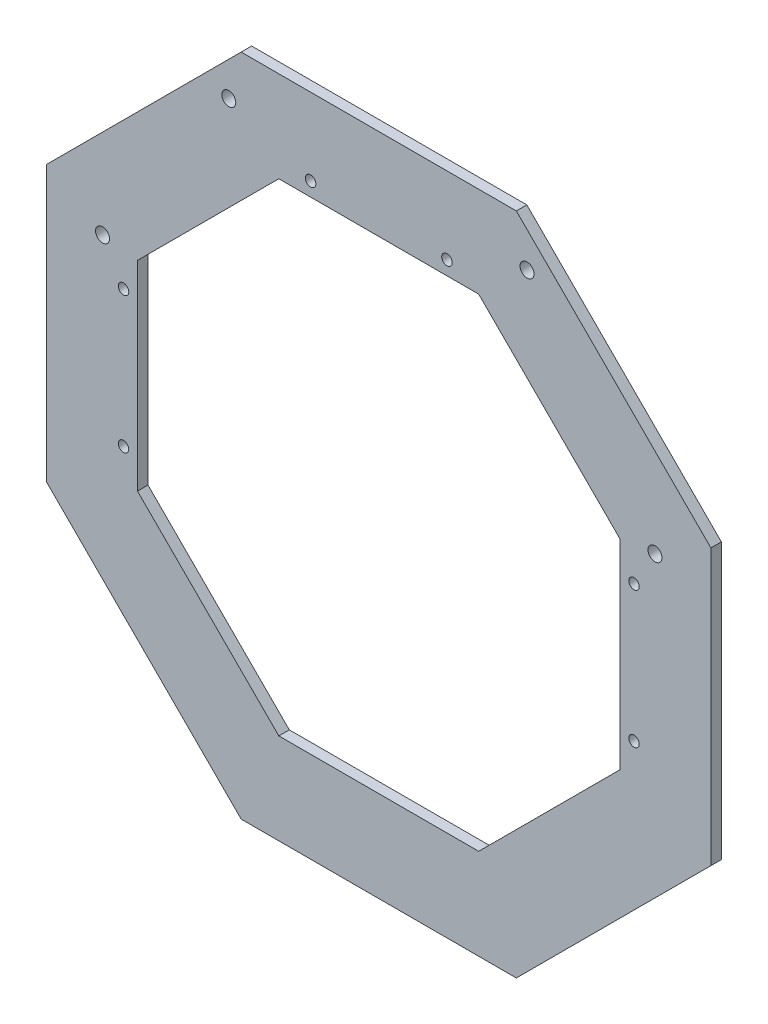
ISO-10303-21;
HEADER;
FILE_DESCRIPTION(('STEP AP214'),'2;1');
FILE_NAME('part.step','',(''),(''),'','','');
FILE_SCHEMA(('AUTOMOTIVE_DESIGN { 1 0 10303 214 1 1 1 1 }'));
ENDSEC;
DATA;
#1=APPLICATION_CONTEXT('core data for automotive mechanical design processes');
#2=APPLICATION_PROTOCOL_DEFINITION('international standard','automotive_design',2000,#1);
#3=PRODUCT_CONTEXT('',#1,'mechanical');
#4=PRODUCT('Part','Part','',(#3));
#5=PRODUCT_RELATED_PRODUCT_CATEGORY('part','',(#4));
#6=PRODUCT_DEFINITION_FORMATION('','',#4);
#7=PRODUCT_DEFINITION_CONTEXT('part definition',#1,'design');
#8=PRODUCT_DEFINITION('design','',#6,#7);
#9=PRODUCT_DEFINITION_SHAPE('','',#8);
#10=(LENGTH_UNIT() NAMED_UNIT(*) SI_UNIT(.MILLI.,.METRE.));
#11=(NAMED_UNIT(*) PLANE_ANGLE_UNIT() SI_UNIT($,.RADIAN.));
#12=(NAMED_UNIT(*) SI_UNIT($,.STERADIAN.) SOLID_ANGLE_UNIT());
#13=UNCERTAINTY_MEASURE_WITH_UNIT(LENGTH_MEASURE(1.E-05),#10,'distance_accuracy_value','');
#14=(GEOMETRIC_REPRESENTATION_CONTEXT(3) GLOBAL_UNCERTAINTY_ASSIGNED_CONTEXT((#13)) GLOBAL_UNIT_ASSIGNED_CONTEXT((#10,
#11,#12)) REPRESENTATION_CONTEXT('',''));
#15=CARTESIAN_POINT('',(0.,0.,0.));
#16=DIRECTION('',(0.,0.,1.));
#17=DIRECTION('',(1.,0.,0.));
#18=AXIS2_PLACEMENT_3D('',#15,#16,#17);
#19=CARTESIAN_POINT('',(39.350288425444,94.9999999999999,3.));
#20=DIRECTION('',(0.,-1.,0.));
#21=DIRECTION('',(1.,0.,0.));
#22=AXIS2_PLACEMENT_3D('',#19,#20,#21);
#23=PLANE('',#22);
#24=DIRECTION('',(-1.,0.,0.));
#25=VECTOR('',#24,1.);
#26=CARTESIAN_POINT('',(39.350288425444,94.9999999999999,0.));
#27=LINE('',#26,#25);
#28=CARTESIAN_POINT('',(39.350288425444,94.9999999999999,0.));
#29=VERTEX_POINT('',#28);
#30=CARTESIAN_POINT('',(-39.3502884254442,94.9999999999997,0.));
#31=VERTEX_POINT('',#30);
#32=EDGE_CURVE('E205',#29,#31,#27,.T.);
#33=ORIENTED_EDGE('',*,*,#32,.T.);
#34=DIRECTION('',(0.,0.,-1.));
#35=VECTOR('',#34,1.);
#36=CARTESIAN_POINT('',(-39.3502884254442,94.9999999999997,3.));
#37=LINE('',#36,#35);
#38=CARTESIAN_POINT('',(-39.3502884254442,94.9999999999997,3.));
#39=VERTEX_POINT('',#38);
#40=EDGE_CURVE('E11',#39,#31,#37,.T.);
#41=ORIENTED_EDGE('',*,*,#40,.F.);
#42=DIRECTION('',(-1.,0.,0.));
#43=VECTOR('',#42,1.);
#44=CARTESIAN_POINT('',(39.350288425444,94.9999999999999,3.));
#45=LINE('',#44,#43);
#46=CARTESIAN_POINT('',(39.350288425444,94.9999999999999,3.));
#47=VERTEX_POINT('',#46);
#48=EDGE_CURVE('E217',#47,#39,#45,.T.);
#49=ORIENTED_EDGE('',*,*,#48,.F.);
#50=DIRECTION('',(0.,0.,-1.));
#51=VECTOR('',#50,1.);
#52=CARTESIAN_POINT('',(39.350288425444,94.9999999999999,3.));
#53=LINE('',#52,#51);
#54=EDGE_CURVE('E235',#47,#29,#53,.T.);
#55=ORIENTED_EDGE('',*,*,#54,.T.);
#56=EDGE_LOOP('',(#33,#41,#49,#55));
#57=FACE_BOUND('',#56,.T.);
#58=ADVANCED_FACE('F32',(#57),#23,.F.);
#59=CARTESIAN_POINT('',(-39.3502884254442,94.9999999999997,3.));
#60=DIRECTION('',(0.707106781186547,-0.707106781186548,0.));
#61=DIRECTION('',(0.707106781186548,0.707106781186547,0.));
#62=AXIS2_PLACEMENT_3D('',#59,#60,#61);
#63=PLANE('',#62);
#64=DIRECTION('',(-0.707106781186548,-0.707106781186547,0.));
#65=VECTOR('',#64,1.);
#66=CARTESIAN_POINT('',(-39.3502884254442,94.9999999999997,0.));
#67=LINE('',#66,#65);
#68=CARTESIAN_POINT('',(-95.0000000000001,39.3502884254438,0.));
#69=VERTEX_POINT('',#68);
#70=EDGE_CURVE('E238',#31,#69,#67,.T.);
#71=ORIENTED_EDGE('',*,*,#70,.T.);
#72=DIRECTION('',(0.,0.,-1.));
#73=VECTOR('',#72,1.);
#74=CARTESIAN_POINT('',(-95.0000000000001,39.3502884254438,3.));
#75=LINE('',#74,#73);
#76=CARTESIAN_POINT('',(-95.0000000000001,39.3502884254438,3.));
#77=VERTEX_POINT('',#76);
#78=EDGE_CURVE('E39',#77,#69,#75,.T.);
#79=ORIENTED_EDGE('',*,*,#78,.F.);
#80=DIRECTION('',(-0.707106781186548,-0.707106781186547,0.));
#81=VECTOR('',#80,1.);
#82=CARTESIAN_POINT('',(-39.3502884254442,94.9999999999997,3.));
#83=LINE('',#82,#81);
#84=EDGE_CURVE('E220',#39,#77,#83,.T.);
#85=ORIENTED_EDGE('',*,*,#84,.F.);
#86=ORIENTED_EDGE('',*,*,#40,.T.);
#87=EDGE_LOOP('',(#71,#79,#85,#86));
#88=FACE_BOUND('',#87,.T.);
#89=ADVANCED_FACE('F293',(#88),#63,.F.);
#90=CARTESIAN_POINT('',(-95.0000000000001,39.3502884254438,3.));
#91=DIRECTION('',(1.,0.,0.));
#92=DIRECTION('',(0.,1.,0.));
#93=AXIS2_PLACEMENT_3D('',#90,#91,#92);
#94=PLANE('',#93);
#95=DIRECTION('',(0.,-1.,0.));
#96=VECTOR('',#95,1.);
#97=CARTESIAN_POINT('',(-95.0000000000001,39.3502884254438,0.));
#98=LINE('',#97,#96);
#99=CARTESIAN_POINT('',(-94.9999999999999,-39.3502884254442,0.));
#100=VERTEX_POINT('',#99);
#101=EDGE_CURVE('E240',#69,#100,#98,.T.);
#102=ORIENTED_EDGE('',*,*,#101,.T.);
#103=DIRECTION('',(0.,0.,-1.));
#104=VECTOR('',#103,1.);
#105=CARTESIAN_POINT('',(-94.9999999999999,-39.3502884254442,3.));
#106=LINE('',#105,#104);
#107=CARTESIAN_POINT('',(-94.9999999999999,-39.3502884254442,3.));
#108=VERTEX_POINT('',#107);
#109=EDGE_CURVE('E265',#108,#100,#106,.T.);
#110=ORIENTED_EDGE('',*,*,#109,.F.);
#111=DIRECTION('',(0.,-1.,0.));
#112=VECTOR('',#111,1.);
#113=CARTESIAN_POINT('',(-95.0000000000001,39.3502884254438,3.));
#114=LINE('',#113,#112);
#115=EDGE_CURVE('E223',#77,#108,#114,.T.);
#116=ORIENTED_EDGE('',*,*,#115,.F.);
#117=ORIENTED_EDGE('',*,*,#78,.T.);
#118=EDGE_LOOP('',(#102,#110,#116,#117));
#119=FACE_BOUND('',#118,.T.);
#120=ADVANCED_FACE('F272',(#119),#94,.F.);
#121=CARTESIAN_POINT('',(-94.9999999999999,-39.3502884254442,3.));
#122=DIRECTION('',(0.707106781186546,0.707106781186549,0.));
#123=DIRECTION('',(-0.707106781186549,0.707106781186546,0.));
#124=AXIS2_PLACEMENT_3D('',#121,#122,#123);
#125=PLANE('',#124);
#126=DIRECTION('',(0.707106781186549,-0.707106781186546,0.));
#127=VECTOR('',#126,1.);
#128=CARTESIAN_POINT('',(-94.9999999999999,-39.3502884254442,0.));
#129=LINE('',#128,#127);
#130=CARTESIAN_POINT('',(-39.3502884254438,-95.0000000000001,0.));
#131=VERTEX_POINT('',#130);
#132=EDGE_CURVE('E242',#100,#131,#129,.T.);
#133=ORIENTED_EDGE('',*,*,#132,.T.);
#134=DIRECTION('',(0.,0.,-1.));
#135=VECTOR('',#134,1.);
#136=CARTESIAN_POINT('',(-39.3502884254438,-95.0000000000001,3.));
#137=LINE('',#136,#135);
#138=CARTESIAN_POINT('',(-39.3502884254438,-95.0000000000001,3.));
#139=VERTEX_POINT('',#138);
#140=EDGE_CURVE('E262',#139,#131,#137,.T.);
#141=ORIENTED_EDGE('',*,*,#140,.F.);
#142=DIRECTION('',(0.707106781186549,-0.707106781186546,0.));
#143=VECTOR('',#142,1.);
#144=CARTESIAN_POINT('',(-94.9999999999999,-39.3502884254442,3.));
#145=LINE('',#144,#143);
#146=EDGE_CURVE('E225',#108,#139,#145,.T.);
#147=ORIENTED_EDGE('',*,*,#146,.F.);
#148=ORIENTED_EDGE('',*,*,#109,.T.);
#149=EDGE_LOOP('',(#133,#141,#147,#148));
#150=FACE_BOUND('',#149,.T.);
#151=ADVANCED_FACE('F283',(#150),#125,.F.);
#152=CARTESIAN_POINT('',(-39.3502884254438,-95.0000000000001,3.));
#153=DIRECTION('',(0.,1.,0.));
#154=DIRECTION('',(-1.,0.,0.));
#155=AXIS2_PLACEMENT_3D('',#152,#153,#154);
#156=PLANE('',#155);
#157=DIRECTION('',(1.,0.,0.));
#158=VECTOR('',#157,1.);
#159=CARTESIAN_POINT('',(-39.3502884254438,-95.0000000000001,0.));
#160=LINE('',#159,#158);
#161=CARTESIAN_POINT('',(39.3502884254442,-94.9999999999999,0.));
#162=VERTEX_POINT('',#161);
#163=EDGE_CURVE('E244',#131,#162,#160,.T.);
#164=ORIENTED_EDGE('',*,*,#163,.T.);
#165=DIRECTION('',(0.,0.,-1.));
#166=VECTOR('',#165,1.);
#167=CARTESIAN_POINT('',(39.3502884254442,-94.9999999999999,3.));
#168=LINE('',#167,#166);
#169=CARTESIAN_POINT('',(39.3502884254442,-94.9999999999999,3.));
#170=VERTEX_POINT('',#169);
#171=EDGE_CURVE('E259',#170,#162,#168,.T.);
#172=ORIENTED_EDGE('',*,*,#171,.F.);
#173=DIRECTION('',(1.,0.,0.));
#174=VECTOR('',#173,1.);
#175=CARTESIAN_POINT('',(-39.3502884254438,-95.0000000000001,3.));
#176=LINE('',#175,#174);
#177=EDGE_CURVE('E227',#139,#170,#176,.T.);
#178=ORIENTED_EDGE('',*,*,#177,.F.);
#179=ORIENTED_EDGE('',*,*,#140,.T.);
#180=EDGE_LOOP('',(#164,#172,#178,#179));
#181=FACE_BOUND('',#180,.T.);
#182=ADVANCED_FACE('F287',(#181),#156,.F.);
#183=CARTESIAN_POINT('',(39.3502884254442,-94.9999999999999,3.));
#184=DIRECTION('',(-0.707106781186547,0.707106781186548,0.));
#185=DIRECTION('',(-0.707106781186548,-0.707106781186547,0.));
#186=AXIS2_PLACEMENT_3D('',#183,#184,#185);
#187=PLANE('',#186);
#188=DIRECTION('',(0.707106781186548,0.707106781186547,0.));
#189=VECTOR('',#188,1.);
#190=CARTESIAN_POINT('',(39.3502884254442,-94.9999999999999,0.));
#191=LINE('',#190,#189);
#192=CARTESIAN_POINT('',(95.0000000000002,-39.350288425444,0.));
#193=VERTEX_POINT('',#192);
#194=EDGE_CURVE('E246',#162,#193,#191,.T.);
#195=ORIENTED_EDGE('',*,*,#194,.T.);
#196=DIRECTION('',(0.,0.,-1.));
#197=VECTOR('',#196,1.);
#198=CARTESIAN_POINT('',(95.0000000000002,-39.350288425444,3.));
#199=LINE('',#198,#197);
#200=CARTESIAN_POINT('',(95.0000000000002,-39.350288425444,3.));
#201=VERTEX_POINT('',#200);
#202=EDGE_CURVE('E256',#201,#193,#199,.T.);
#203=ORIENTED_EDGE('',*,*,#202,.F.);
#204=DIRECTION('',(0.707106781186548,0.707106781186547,0.));
#205=VECTOR('',#204,1.);
#206=CARTESIAN_POINT('',(39.3502884254442,-94.9999999999999,3.));
#207=LINE('',#206,#205);
#208=EDGE_CURVE('E229',#170,#201,#207,.T.);
#209=ORIENTED_EDGE('',*,*,#208,.F.);
#210=ORIENTED_EDGE('',*,*,#171,.T.);
#211=EDGE_LOOP('',(#195,#203,#209,#210));
#212=FACE_BOUND('',#211,.T.);
#213=ADVANCED_FACE('F306',(#212),#187,.F.);
#214=CARTESIAN_POINT('',(95.0000000000002,-39.350288425444,3.));
#215=DIRECTION('',(-1.,0.,0.));
#216=DIRECTION('',(0.,-1.,0.));
#217=AXIS2_PLACEMENT_3D('',#214,#215,#216);
#218=PLANE('',#217);
#219=DIRECTION('',(0.,1.,0.));
#220=VECTOR('',#219,1.);
#221=CARTESIAN_POINT('',(95.0000000000002,-39.350288425444,0.));
#222=LINE('',#221,#220);
#223=CARTESIAN_POINT('',(95.,39.3502884254441,0.));
#224=VERTEX_POINT('',#223);
#225=EDGE_CURVE('E248',#193,#224,#222,.T.);
#226=ORIENTED_EDGE('',*,*,#225,.T.);
#227=DIRECTION('',(0.,0.,-1.));
#228=VECTOR('',#227,1.);
#229=CARTESIAN_POINT('',(95.,39.3502884254441,3.));
#230=LINE('',#229,#228);
#231=CARTESIAN_POINT('',(95.,39.3502884254441,3.));
#232=VERTEX_POINT('',#231);
#233=EDGE_CURVE('E253',#232,#224,#230,.T.);
#234=ORIENTED_EDGE('',*,*,#233,.F.);
#235=DIRECTION('',(0.,1.,0.));
#236=VECTOR('',#235,1.);
#237=CARTESIAN_POINT('',(95.0000000000002,-39.350288425444,3.));
#238=LINE('',#237,#236);
#239=EDGE_CURVE('E231',#201,#232,#238,.T.);
#240=ORIENTED_EDGE('',*,*,#239,.F.);
#241=ORIENTED_EDGE('',*,*,#202,.T.);
#242=EDGE_LOOP('',(#226,#234,#240,#241));
#243=FACE_BOUND('',#242,.T.);
#244=ADVANCED_FACE('F304',(#243),#218,.F.);
#245=CARTESIAN_POINT('',(95.,39.3502884254441,3.));
#246=DIRECTION('',(-0.707106781186546,-0.707106781186549,0.));
#247=DIRECTION('',(0.707106781186549,-0.707106781186546,0.));
#248=AXIS2_PLACEMENT_3D('',#245,#246,#247);
#249=PLANE('',#248);
#250=DIRECTION('',(-0.707106781186549,0.707106781186546,0.));
#251=VECTOR('',#250,1.);
#252=CARTESIAN_POINT('',(95.,39.3502884254441,0.));
#253=LINE('',#252,#251);
#254=EDGE_CURVE('E221',#224,#29,#253,.T.);
#255=ORIENTED_EDGE('',*,*,#254,.T.);
#256=ORIENTED_EDGE('',*,*,#54,.F.);
#257=DIRECTION('',(-0.707106781186549,0.707106781186546,0.));
#258=VECTOR('',#257,1.);
#259=CARTESIAN_POINT('',(95.,39.3502884254441,3.));
#260=LINE('',#259,#258);
#261=EDGE_CURVE('E233',#232,#47,#260,.T.);
#262=ORIENTED_EDGE('',*,*,#261,.F.);
#263=ORIENTED_EDGE('',*,*,#233,.T.);
#264=EDGE_LOOP('',(#255,#256,#262,#263));
#265=FACE_BOUND('',#264,.T.);
#266=ADVANCED_FACE('F299',(#265),#249,.F.);
#267=CARTESIAN_POINT('',(0.,0.,3.));
#268=DIRECTION('',(0.,0.,1.));
#269=DIRECTION('',(1.,0.,0.));
#270=AXIS2_PLACEMENT_3D('',#267,#268,#269);
#271=PLANE('',#270);
#272=CARTESIAN_POINT('',(-79.0000000000001,29.8944443027285,3.));
#273=DIRECTION('',(0.,0.,1.));
#274=DIRECTION('',(1.,0.,0.));
#275=AXIS2_PLACEMENT_3D('',#272,#273,#274);
#276=CIRCLE('',#275,2.);
#277=CARTESIAN_POINT('',(-77.0000000000001,29.8944443027285,3.));
#278=VERTEX_POINT('',#277);
#279=EDGE_CURVE('E550',#278,#278,#276,.T.);
#280=ORIENTED_EDGE('',*,*,#279,.F.);
#281=EDGE_LOOP('',(#280));
#282=FACE_BOUND('',#281,.T.);
#283=CARTESIAN_POINT('',(79.,29.8944443027287,3.));
#284=DIRECTION('',(0.,0.,1.));
#285=DIRECTION('',(-1.,0.,0.));
#286=AXIS2_PLACEMENT_3D('',#283,#284,#285);
#287=CIRCLE('',#286,2.);
#288=CARTESIAN_POINT('',(77.,29.8944443027287,3.));
#289=VERTEX_POINT('',#288);
#290=EDGE_CURVE('E552',#289,#289,#287,.T.);
#291=ORIENTED_EDGE('',*,*,#290,.F.);
#292=EDGE_LOOP('',(#291));
#293=FACE_BOUND('',#292,.T.);
#294=CARTESIAN_POINT('',(42.4093721325955,81.8999999999999,3.));
#295=DIRECTION('',(0.,0.,1.));
#296=DIRECTION('',(1.,0.,0.));
#297=AXIS2_PLACEMENT_3D('',#294,#295,#296);
#298=CIRCLE('',#297,2.);
#299=CARTESIAN_POINT('',(44.4093721325955,81.8999999999999,3.));
#300=VERTEX_POINT('',#299);
#301=EDGE_CURVE('E638',#300,#300,#298,.T.);
#302=ORIENTED_EDGE('',*,*,#301,.F.);
#303=EDGE_LOOP('',(#302));
#304=FACE_BOUND('',#303,.T.);
#305=CARTESIAN_POINT('',(-42.8922148450701,81.6999999999999,3.));
#306=DIRECTION('',(0.,0.,1.));
#307=DIRECTION('',(1.,0.,0.));
#308=AXIS2_PLACEMENT_3D('',#305,#306,#307);
#309=CIRCLE('',#308,2.);
#310=CARTESIAN_POINT('',(-40.8922148450701,81.6999999999999,3.));
#311=VERTEX_POINT('',#310);
#312=EDGE_CURVE('E560',#311,#311,#309,.T.);
#313=ORIENTED_EDGE('',*,*,#312,.F.);
#314=EDGE_LOOP('',(#313));
#315=FACE_BOUND('',#314,.T.);
#316=CARTESIAN_POINT('',(-73.0000000000002,19.4999999999998,3.));
#317=DIRECTION('',(0.,0.,-1.));
#318=DIRECTION('',(1.,0.,0.));
#319=AXIS2_PLACEMENT_3D('',#316,#317,#318);
#320=CIRCLE('',#319,1.5);
#321=CARTESIAN_POINT('',(-71.5000000000002,19.4999999999998,3.));
#322=VERTEX_POINT('',#321);
#323=EDGE_CURVE('E577',#322,#322,#320,.T.);
#324=ORIENTED_EDGE('',*,*,#323,.T.);
#325=EDGE_LOOP('',(#324));
#326=FACE_BOUND('',#325,.T.);
#327=CARTESIAN_POINT('',(73.0000000000002,-19.5,3.));
#328=DIRECTION('',(0.,0.,-1.));
#329=DIRECTION('',(-1.,0.,0.));
#330=AXIS2_PLACEMENT_3D('',#327,#328,#329);
#331=CIRCLE('',#330,1.5);
#332=CARTESIAN_POINT('',(71.5000000000002,-19.5,3.));
#333=VERTEX_POINT('',#332);
#334=EDGE_CURVE('E570',#333,#333,#331,.T.);
#335=ORIENTED_EDGE('',*,*,#334,.T.);
#336=EDGE_LOOP('',(#335));
#337=FACE_BOUND('',#336,.T.);
#338=CARTESIAN_POINT('',(73.0000000000002,19.5,3.));
#339=DIRECTION('',(0.,0.,-1.));
#340=DIRECTION('',(-1.,0.,0.));
#341=AXIS2_PLACEMENT_3D('',#338,#339,#340);
#342=CIRCLE('',#341,1.5);
#343=CARTESIAN_POINT('',(71.5000000000002,19.5,3.));
#344=VERTEX_POINT('',#343);
#345=EDGE_CURVE('E588',#344,#344,#342,.T.);
#346=ORIENTED_EDGE('',*,*,#345,.T.);
#347=EDGE_LOOP('',(#346));
#348=FACE_BOUND('',#347,.T.);
#349=CARTESIAN_POINT('',(-19.5,73.0000000000007,3.));
#350=DIRECTION('',(0.,0.,-1.));
#351=DIRECTION('',(-1.,0.,0.));
#352=AXIS2_PLACEMENT_3D('',#349,#350,#351);
#353=CIRCLE('',#352,1.5);
#354=CARTESIAN_POINT('',(-21.,73.0000000000007,3.));
#355=VERTEX_POINT('',#354);
#356=EDGE_CURVE('E582',#355,#355,#353,.T.);
#357=ORIENTED_EDGE('',*,*,#356,.T.);
#358=EDGE_LOOP('',(#357));
#359=FACE_BOUND('',#358,.T.);
#360=CARTESIAN_POINT('',(-73.0000000000002,-19.5000000000001,3.));
#361=DIRECTION('',(0.,0.,-1.));
#362=DIRECTION('',(1.,0.,0.));
#363=AXIS2_PLACEMENT_3D('',#360,#361,#362);
#364=CIRCLE('',#363,1.5);
#365=CARTESIAN_POINT('',(-71.5000000000002,-19.5000000000001,3.));
#366=VERTEX_POINT('',#365);
#367=EDGE_CURVE('E564',#366,#366,#364,.T.);
#368=ORIENTED_EDGE('',*,*,#367,.T.);
#369=EDGE_LOOP('',(#368));
#370=FACE_BOUND('',#369,.T.);
#371=CARTESIAN_POINT('',(19.5,73.0000000000002,3.));
#372=DIRECTION('',(0.,0.,-1.));
#373=DIRECTION('',(-1.,0.,0.));
#374=AXIS2_PLACEMENT_3D('',#371,#372,#373);
#375=CIRCLE('',#374,1.5);
#376=CARTESIAN_POINT('',(18.,73.0000000000002,3.));
#377=VERTEX_POINT('',#376);
#378=EDGE_CURVE('E187',#377,#377,#375,.T.);
#379=ORIENTED_EDGE('',*,*,#378,.T.);
#380=EDGE_LOOP('',(#379));
#381=FACE_BOUND('',#380,.T.);
#382=DIRECTION('',(0.,-1.,0.));
#383=VECTOR('',#382,1.);
#384=CARTESIAN_POINT('',(69.0000000000002,28.5807358037431,3.));
#385=LINE('',#384,#383);
#386=CARTESIAN_POINT('',(69.0000000000002,28.5807358037431,3.));
#387=VERTEX_POINT('',#386);
#388=CARTESIAN_POINT('',(68.9999999999998,-28.5807358037441,3.));
#389=VERTEX_POINT('',#388);
#390=EDGE_CURVE('E146',#387,#389,#385,.T.);
#391=ORIENTED_EDGE('',*,*,#390,.T.);
#392=DIRECTION('',(-0.707106781186553,-0.707106781186542,0.));
#393=VECTOR('',#392,1.);
#394=CARTESIAN_POINT('',(68.9999999999998,-28.5807358037441,3.));
#395=LINE('',#394,#393);
#396=CARTESIAN_POINT('',(28.5807358037431,-69.0000000000002,3.));
#397=VERTEX_POINT('',#396);
#398=EDGE_CURVE('E155',#389,#397,#395,.T.);
#399=ORIENTED_EDGE('',*,*,#398,.T.);
#400=DIRECTION('',(-1.,0.,0.));
#401=VECTOR('',#400,1.);
#402=CARTESIAN_POINT('',(28.5807358037431,-69.0000000000002,3.));
#403=LINE('',#402,#401);
#404=CARTESIAN_POINT('',(-28.5807358037441,-68.9999999999998,3.));
#405=VERTEX_POINT('',#404);
#406=EDGE_CURVE('E46',#397,#405,#403,.T.);
#407=ORIENTED_EDGE('',*,*,#406,.T.);
#408=DIRECTION('',(-0.707106781186542,0.707106781186553,0.));
#409=VECTOR('',#408,1.);
#410=CARTESIAN_POINT('',(-28.5807358037441,-68.9999999999998,3.));
#411=LINE('',#410,#409);
#412=CARTESIAN_POINT('',(-69.0000000000002,-28.580735803743,3.));
#413=VERTEX_POINT('',#412);
#414=EDGE_CURVE('E173',#405,#413,#411,.T.);
#415=ORIENTED_EDGE('',*,*,#414,.T.);
#416=DIRECTION('',(0.,1.,0.));
#417=VECTOR('',#416,1.);
#418=CARTESIAN_POINT('',(-69.0000000000002,-28.580735803743,3.));
#419=LINE('',#418,#417);
#420=CARTESIAN_POINT('',(-68.9999999999998,28.5807358037441,3.));
#421=VERTEX_POINT('',#420);
#422=EDGE_CURVE('E176',#413,#421,#419,.T.);
#423=ORIENTED_EDGE('',*,*,#422,.T.);
#424=DIRECTION('',(0.707106781186553,0.707106781186542,0.));
#425=VECTOR('',#424,1.);
#426=CARTESIAN_POINT('',(-68.9999999999998,28.5807358037441,3.));
#427=LINE('',#426,#425);
#428=CARTESIAN_POINT('',(-28.580735803743,69.0000000000002,3.));
#429=VERTEX_POINT('',#428);
#430=EDGE_CURVE('E179',#421,#429,#427,.T.);
#431=ORIENTED_EDGE('',*,*,#430,.T.);
#432=DIRECTION('',(1.,0.,0.));
#433=VECTOR('',#432,1.);
#434=CARTESIAN_POINT('',(-28.580735803743,69.0000000000002,3.));
#435=LINE('',#434,#433);
#436=CARTESIAN_POINT('',(28.5807358037441,68.9999999999998,3.));
#437=VERTEX_POINT('',#436);
#438=EDGE_CURVE('E182',#429,#437,#435,.T.);
#439=ORIENTED_EDGE('',*,*,#438,.T.);
#440=DIRECTION('',(0.707106781186542,-0.707106781186553,0.));
#441=VECTOR('',#440,1.);
#442=CARTESIAN_POINT('',(28.5807358037441,68.9999999999998,3.));
#443=LINE('',#442,#441);
#444=EDGE_CURVE('E152',#437,#387,#443,.T.);
#445=ORIENTED_EDGE('',*,*,#444,.T.);
#446=EDGE_LOOP('',(#391,#399,#407,#415,#423,#431,#439,#445));
#447=FACE_BOUND('',#446,.T.);
#448=ORIENTED_EDGE('',*,*,#48,.T.);
#449=ORIENTED_EDGE('',*,*,#84,.T.);
#450=ORIENTED_EDGE('',*,*,#115,.T.);
#451=ORIENTED_EDGE('',*,*,#146,.T.);
#452=ORIENTED_EDGE('',*,*,#177,.T.);
#453=ORIENTED_EDGE('',*,*,#208,.T.);
#454=ORIENTED_EDGE('',*,*,#239,.T.);
#455=ORIENTED_EDGE('',*,*,#261,.T.);
#456=EDGE_LOOP('',(#448,#449,#450,#451,#452,#453,#454,#455));
#457=FACE_BOUND('',#456,.T.);
#458=ADVANCED_FACE('F159',(#282,#293,#304,#315,#326,#337,#348,#359,#370,#381,#447,#457),#271,.T.);
#459=CARTESIAN_POINT('',(0.,0.,0.));
#460=DIRECTION('',(0.,0.,1.));
#461=DIRECTION('',(1.,0.,0.));
#462=AXIS2_PLACEMENT_3D('',#459,#460,#461);
#463=PLANE('',#462);
#464=CARTESIAN_POINT('',(-79.0000000000001,29.8944443027285,0.));
#465=DIRECTION('',(0.,0.,1.));
#466=DIRECTION('',(1.,0.,0.));
#467=AXIS2_PLACEMENT_3D('',#464,#465,#466);
#468=CIRCLE('',#467,2.);
#469=CARTESIAN_POINT('',(-77.0000000000001,29.8944443027285,0.));
#470=VERTEX_POINT('',#469);
#471=EDGE_CURVE('E547',#470,#470,#468,.T.);
#472=ORIENTED_EDGE('',*,*,#471,.T.);
#473=EDGE_LOOP('',(#472));
#474=FACE_BOUND('',#473,.T.);
#475=CARTESIAN_POINT('',(79.,29.8944443027287,0.));
#476=DIRECTION('',(0.,0.,1.));
#477=DIRECTION('',(-1.,0.,0.));
#478=AXIS2_PLACEMENT_3D('',#475,#476,#477);
#479=CIRCLE('',#478,2.);
#480=CARTESIAN_POINT('',(77.,29.8944443027287,0.));
#481=VERTEX_POINT('',#480);
#482=EDGE_CURVE('E643',#481,#481,#479,.T.);
#483=ORIENTED_EDGE('',*,*,#482,.T.);
#484=EDGE_LOOP('',(#483));
#485=FACE_BOUND('',#484,.T.);
#486=CARTESIAN_POINT('',(42.4093721325955,81.8999999999999,0.));
#487=DIRECTION('',(0.,0.,1.));
#488=DIRECTION('',(1.,0.,0.));
#489=AXIS2_PLACEMENT_3D('',#486,#487,#488);
#490=CIRCLE('',#489,2.);
#491=CARTESIAN_POINT('',(44.4093721325955,81.8999999999999,0.));
#492=VERTEX_POINT('',#491);
#493=EDGE_CURVE('E563',#492,#492,#490,.T.);
#494=ORIENTED_EDGE('',*,*,#493,.T.);
#495=EDGE_LOOP('',(#494));
#496=FACE_BOUND('',#495,.T.);
#497=CARTESIAN_POINT('',(-42.8922148450701,81.6999999999999,0.));
#498=DIRECTION('',(0.,0.,1.));
#499=DIRECTION('',(1.,0.,0.));
#500=AXIS2_PLACEMENT_3D('',#497,#498,#499);
#501=CIRCLE('',#500,2.);
#502=CARTESIAN_POINT('',(-40.8922148450701,81.6999999999999,0.));
#503=VERTEX_POINT('',#502);
#504=EDGE_CURVE('E556',#503,#503,#501,.T.);
#505=ORIENTED_EDGE('',*,*,#504,.T.);
#506=EDGE_LOOP('',(#505));
#507=FACE_BOUND('',#506,.T.);
#508=CARTESIAN_POINT('',(-73.0000000000002,19.4999999999998,0.));
#509=DIRECTION('',(0.,0.,-1.));
#510=DIRECTION('',(1.,0.,0.));
#511=AXIS2_PLACEMENT_3D('',#508,#509,#510);
#512=CIRCLE('',#511,1.5);
#513=CARTESIAN_POINT('',(-71.5000000000002,19.4999999999998,0.));
#514=VERTEX_POINT('',#513);
#515=EDGE_CURVE('E567',#514,#514,#512,.T.);
#516=ORIENTED_EDGE('',*,*,#515,.F.);
#517=EDGE_LOOP('',(#516));
#518=FACE_BOUND('',#517,.T.);
#519=CARTESIAN_POINT('',(73.0000000000002,-19.5,0.));
#520=DIRECTION('',(0.,0.,-1.));
#521=DIRECTION('',(-1.,0.,0.));
#522=AXIS2_PLACEMENT_3D('',#519,#520,#521);
#523=CIRCLE('',#522,1.5);
#524=CARTESIAN_POINT('',(71.5000000000002,-19.5,0.));
#525=VERTEX_POINT('',#524);
#526=EDGE_CURVE('E574',#525,#525,#523,.T.);
#527=ORIENTED_EDGE('',*,*,#526,.F.);
#528=EDGE_LOOP('',(#527));
#529=FACE_BOUND('',#528,.T.);
#530=CARTESIAN_POINT('',(73.0000000000002,19.5,0.));
#531=DIRECTION('',(0.,0.,-1.));
#532=DIRECTION('',(-1.,0.,0.));
#533=AXIS2_PLACEMENT_3D('',#530,#531,#532);
#534=CIRCLE('',#533,1.5);
#535=CARTESIAN_POINT('',(71.5000000000002,19.5,0.));
#536=VERTEX_POINT('',#535);
#537=EDGE_CURVE('E573',#536,#536,#534,.T.);
#538=ORIENTED_EDGE('',*,*,#537,.F.);
#539=EDGE_LOOP('',(#538));
#540=FACE_BOUND('',#539,.T.);
#541=CARTESIAN_POINT('',(-19.5,73.0000000000007,0.));
#542=DIRECTION('',(0.,0.,-1.));
#543=DIRECTION('',(-1.,0.,0.));
#544=AXIS2_PLACEMENT_3D('',#541,#542,#543);
#545=CIRCLE('',#544,1.5);
#546=CARTESIAN_POINT('',(-21.,73.0000000000007,0.));
#547=VERTEX_POINT('',#546);
#548=EDGE_CURVE('E585',#547,#547,#545,.T.);
#549=ORIENTED_EDGE('',*,*,#548,.F.);
#550=EDGE_LOOP('',(#549));
#551=FACE_BOUND('',#550,.T.);
#552=CARTESIAN_POINT('',(-73.0000000000002,-19.5000000000001,0.));
#553=DIRECTION('',(0.,0.,-1.));
#554=DIRECTION('',(1.,0.,0.));
#555=AXIS2_PLACEMENT_3D('',#552,#553,#554);
#556=CIRCLE('',#555,1.5);
#557=CARTESIAN_POINT('',(-71.5000000000002,-19.5000000000001,0.));
#558=VERTEX_POINT('',#557);
#559=EDGE_CURVE('E559',#558,#558,#556,.T.);
#560=ORIENTED_EDGE('',*,*,#559,.F.);
#561=EDGE_LOOP('',(#560));
#562=FACE_BOUND('',#561,.T.);
#563=CARTESIAN_POINT('',(19.5,73.0000000000002,0.));
#564=DIRECTION('',(0.,0.,-1.));
#565=DIRECTION('',(-1.,0.,0.));
#566=AXIS2_PLACEMENT_3D('',#563,#564,#565);
#567=CIRCLE('',#566,1.5);
#568=CARTESIAN_POINT('',(18.,73.0000000000002,0.));
#569=VERTEX_POINT('',#568);
#570=EDGE_CURVE('E169',#569,#569,#567,.T.);
#571=ORIENTED_EDGE('',*,*,#570,.F.);
#572=EDGE_LOOP('',(#571));
#573=FACE_BOUND('',#572,.T.);
#574=DIRECTION('',(-0.707106781186553,-0.707106781186542,0.));
#575=VECTOR('',#574,1.);
#576=CARTESIAN_POINT('',(68.9999999999998,-28.5807358037441,0.));
#577=LINE('',#576,#575);
#578=CARTESIAN_POINT('',(68.9999999999998,-28.5807358037441,0.));
#579=VERTEX_POINT('',#578);
#580=CARTESIAN_POINT('',(28.5807358037431,-69.0000000000002,0.));
#581=VERTEX_POINT('',#580);
#582=EDGE_CURVE('E186',#579,#581,#577,.T.);
#583=ORIENTED_EDGE('',*,*,#582,.F.);
#584=DIRECTION('',(0.,-1.,0.));
#585=VECTOR('',#584,1.);
#586=CARTESIAN_POINT('',(69.0000000000002,28.5807358037431,0.));
#587=LINE('',#586,#585);
#588=CARTESIAN_POINT('',(69.0000000000002,28.5807358037431,0.));
#589=VERTEX_POINT('',#588);
#590=EDGE_CURVE('E54',#589,#579,#587,.T.);
#591=ORIENTED_EDGE('',*,*,#590,.F.);
#592=DIRECTION('',(0.707106781186542,-0.707106781186553,0.));
#593=VECTOR('',#592,1.);
#594=CARTESIAN_POINT('',(28.5807358037441,68.9999999999998,0.));
#595=LINE('',#594,#593);
#596=CARTESIAN_POINT('',(28.5807358037441,68.9999999999998,0.));
#597=VERTEX_POINT('',#596);
#598=EDGE_CURVE('E163',#597,#589,#595,.T.);
#599=ORIENTED_EDGE('',*,*,#598,.F.);
#600=DIRECTION('',(1.,0.,0.));
#601=VECTOR('',#600,1.);
#602=CARTESIAN_POINT('',(-28.580735803743,69.0000000000002,0.));
#603=LINE('',#602,#601);
#604=CARTESIAN_POINT('',(-28.580735803743,69.0000000000002,0.));
#605=VERTEX_POINT('',#604);
#606=EDGE_CURVE('E166',#605,#597,#603,.T.);
#607=ORIENTED_EDGE('',*,*,#606,.F.);
#608=DIRECTION('',(0.707106781186553,0.707106781186542,0.));
#609=VECTOR('',#608,1.);
#610=CARTESIAN_POINT('',(-68.9999999999998,28.5807358037441,0.));
#611=LINE('',#610,#609);
#612=CARTESIAN_POINT('',(-68.9999999999998,28.5807358037441,0.));
#613=VERTEX_POINT('',#612);
#614=EDGE_CURVE('E198',#613,#605,#611,.T.);
#615=ORIENTED_EDGE('',*,*,#614,.F.);
#616=DIRECTION('',(0.,1.,0.));
#617=VECTOR('',#616,1.);
#618=CARTESIAN_POINT('',(-69.0000000000002,-28.580735803743,0.));
#619=LINE('',#618,#617);
#620=CARTESIAN_POINT('',(-69.0000000000002,-28.580735803743,0.));
#621=VERTEX_POINT('',#620);
#622=EDGE_CURVE('E195',#621,#613,#619,.T.);
#623=ORIENTED_EDGE('',*,*,#622,.F.);
#624=DIRECTION('',(-0.707106781186542,0.707106781186553,0.));
#625=VECTOR('',#624,1.);
#626=CARTESIAN_POINT('',(-28.5807358037441,-68.9999999999998,0.));
#627=LINE('',#626,#625);
#628=CARTESIAN_POINT('',(-28.5807358037441,-68.9999999999998,0.));
#629=VERTEX_POINT('',#628);
#630=EDGE_CURVE('E192',#629,#621,#627,.T.);
#631=ORIENTED_EDGE('',*,*,#630,.F.);
#632=DIRECTION('',(-1.,0.,0.));
#633=VECTOR('',#632,1.);
#634=CARTESIAN_POINT('',(28.5807358037431,-69.0000000000002,0.));
#635=LINE('',#634,#633);
#636=EDGE_CURVE('E189',#581,#629,#635,.T.);
#637=ORIENTED_EDGE('',*,*,#636,.F.);
#638=EDGE_LOOP('',(#583,#591,#599,#607,#615,#623,#631,#637));
#639=FACE_BOUND('',#638,.T.);
#640=ORIENTED_EDGE('',*,*,#32,.F.);
#641=ORIENTED_EDGE('',*,*,#254,.F.);
#642=ORIENTED_EDGE('',*,*,#225,.F.);
#643=ORIENTED_EDGE('',*,*,#194,.F.);
#644=ORIENTED_EDGE('',*,*,#163,.F.);
#645=ORIENTED_EDGE('',*,*,#132,.F.);
#646=ORIENTED_EDGE('',*,*,#101,.F.);
#647=ORIENTED_EDGE('',*,*,#70,.F.);
#648=EDGE_LOOP('',(#640,#641,#642,#643,#644,#645,#646,#647));
#649=FACE_BOUND('',#648,.T.);
#650=ADVANCED_FACE('F278',(#474,#485,#496,#507,#518,#529,#540,#551,#562,#573,#639,#649),#463,.F.);
#651=CARTESIAN_POINT('',(69.0000000000002,28.5807358037431,3.));
#652=DIRECTION('',(1.,0.,0.));
#653=DIRECTION('',(0.,1.,0.));
#654=AXIS2_PLACEMENT_3D('',#651,#652,#653);
#655=PLANE('',#654);
#656=ORIENTED_EDGE('',*,*,#590,.T.);
#657=DIRECTION('',(0.,0.,-1.));
#658=VECTOR('',#657,1.);
#659=CARTESIAN_POINT('',(68.9999999999998,-28.5807358037441,3.));
#660=LINE('',#659,#658);
#661=EDGE_CURVE('E142',#389,#579,#660,.T.);
#662=ORIENTED_EDGE('',*,*,#661,.F.);
#663=ORIENTED_EDGE('',*,*,#390,.F.);
#664=DIRECTION('',(0.,0.,-1.));
#665=VECTOR('',#664,1.);
#666=CARTESIAN_POINT('',(69.0000000000002,28.5807358037431,3.));
#667=LINE('',#666,#665);
#668=EDGE_CURVE('E203',#387,#589,#667,.T.);
#669=ORIENTED_EDGE('',*,*,#668,.T.);
#670=EDGE_LOOP('',(#656,#662,#663,#669));
#671=FACE_BOUND('',#670,.T.);
#672=ADVANCED_FACE('F144',(#671),#655,.F.);
#673=CARTESIAN_POINT('',(28.5807358037441,68.9999999999998,3.));
#674=DIRECTION('',(0.707106781186553,0.707106781186542,0.));
#675=DIRECTION('',(-0.707106781186542,0.707106781186553,0.));
#676=AXIS2_PLACEMENT_3D('',#673,#674,#675);
#677=PLANE('',#676);
#678=ORIENTED_EDGE('',*,*,#598,.T.);
#679=ORIENTED_EDGE('',*,*,#668,.F.);
#680=ORIENTED_EDGE('',*,*,#444,.F.);
#681=DIRECTION('',(0.,0.,-1.));
#682=VECTOR('',#681,1.);
#683=CARTESIAN_POINT('',(28.5807358037441,68.9999999999998,3.));
#684=LINE('',#683,#682);
#685=EDGE_CURVE('E206',#437,#597,#684,.T.);
#686=ORIENTED_EDGE('',*,*,#685,.T.);
#687=EDGE_LOOP('',(#678,#679,#680,#686));
#688=FACE_BOUND('',#687,.T.);
#689=ADVANCED_FACE('F362',(#688),#677,.F.);
#690=CARTESIAN_POINT('',(-28.580735803743,69.0000000000002,3.));
#691=DIRECTION('',(0.,1.,0.));
#692=DIRECTION('',(-1.,0.,0.));
#693=AXIS2_PLACEMENT_3D('',#690,#691,#692);
#694=PLANE('',#693);
#695=ORIENTED_EDGE('',*,*,#606,.T.);
#696=ORIENTED_EDGE('',*,*,#685,.F.);
#697=ORIENTED_EDGE('',*,*,#438,.F.);
#698=DIRECTION('',(0.,0.,-1.));
#699=VECTOR('',#698,1.);
#700=CARTESIAN_POINT('',(-28.580735803743,69.0000000000002,3.));
#701=LINE('',#700,#699);
#702=EDGE_CURVE('E208',#429,#605,#701,.T.);
#703=ORIENTED_EDGE('',*,*,#702,.T.);
#704=EDGE_LOOP('',(#695,#696,#697,#703));
#705=FACE_BOUND('',#704,.T.);
#706=ADVANCED_FACE('F373',(#705),#694,.F.);
#707=CARTESIAN_POINT('',(-68.9999999999998,28.5807358037441,3.));
#708=DIRECTION('',(-0.707106781186542,0.707106781186553,0.));
#709=DIRECTION('',(-0.707106781186553,-0.707106781186542,0.));
#710=AXIS2_PLACEMENT_3D('',#707,#708,#709);
#711=PLANE('',#710);
#712=ORIENTED_EDGE('',*,*,#614,.T.);
#713=ORIENTED_EDGE('',*,*,#702,.F.);
#714=ORIENTED_EDGE('',*,*,#430,.F.);
#715=DIRECTION('',(0.,0.,-1.));
#716=VECTOR('',#715,1.);
#717=CARTESIAN_POINT('',(-68.9999999999998,28.5807358037441,3.));
#718=LINE('',#717,#716);
#719=EDGE_CURVE('E210',#421,#613,#718,.T.);
#720=ORIENTED_EDGE('',*,*,#719,.T.);
#721=EDGE_LOOP('',(#712,#713,#714,#720));
#722=FACE_BOUND('',#721,.T.);
#723=ADVANCED_FACE('F383',(#722),#711,.F.);
#724=CARTESIAN_POINT('',(-69.0000000000002,-28.580735803743,3.));
#725=DIRECTION('',(-1.,0.,0.));
#726=DIRECTION('',(0.,-1.,0.));
#727=AXIS2_PLACEMENT_3D('',#724,#725,#726);
#728=PLANE('',#727);
#729=ORIENTED_EDGE('',*,*,#622,.T.);
#730=ORIENTED_EDGE('',*,*,#719,.F.);
#731=ORIENTED_EDGE('',*,*,#422,.F.);
#732=DIRECTION('',(0.,0.,-1.));
#733=VECTOR('',#732,1.);
#734=CARTESIAN_POINT('',(-69.0000000000002,-28.580735803743,3.));
#735=LINE('',#734,#733);
#736=EDGE_CURVE('E212',#413,#621,#735,.T.);
#737=ORIENTED_EDGE('',*,*,#736,.T.);
#738=EDGE_LOOP('',(#729,#730,#731,#737));
#739=FACE_BOUND('',#738,.T.);
#740=ADVANCED_FACE('F393',(#739),#728,.F.);
#741=CARTESIAN_POINT('',(-28.5807358037441,-68.9999999999998,3.));
#742=DIRECTION('',(-0.707106781186553,-0.707106781186542,0.));
#743=DIRECTION('',(0.707106781186542,-0.707106781186553,0.));
#744=AXIS2_PLACEMENT_3D('',#741,#742,#743);
#745=PLANE('',#744);
#746=ORIENTED_EDGE('',*,*,#630,.T.);
#747=ORIENTED_EDGE('',*,*,#736,.F.);
#748=ORIENTED_EDGE('',*,*,#414,.F.);
#749=DIRECTION('',(0.,0.,-1.));
#750=VECTOR('',#749,1.);
#751=CARTESIAN_POINT('',(-28.5807358037441,-68.9999999999998,3.));
#752=LINE('',#751,#750);
#753=EDGE_CURVE('E214',#405,#629,#752,.T.);
#754=ORIENTED_EDGE('',*,*,#753,.T.);
#755=EDGE_LOOP('',(#746,#747,#748,#754));
#756=FACE_BOUND('',#755,.T.);
#757=ADVANCED_FACE('F403',(#756),#745,.F.);
#758=CARTESIAN_POINT('',(28.5807358037431,-69.0000000000002,3.));
#759=DIRECTION('',(0.,-1.,0.));
#760=DIRECTION('',(1.,0.,0.));
#761=AXIS2_PLACEMENT_3D('',#758,#759,#760);
#762=PLANE('',#761);
#763=ORIENTED_EDGE('',*,*,#636,.T.);
#764=ORIENTED_EDGE('',*,*,#753,.F.);
#765=ORIENTED_EDGE('',*,*,#406,.F.);
#766=DIRECTION('',(0.,0.,-1.));
#767=VECTOR('',#766,1.);
#768=CARTESIAN_POINT('',(28.5807358037431,-69.0000000000002,3.));
#769=LINE('',#768,#767);
#770=EDGE_CURVE('E151',#397,#581,#769,.T.);
#771=ORIENTED_EDGE('',*,*,#770,.T.);
#772=EDGE_LOOP('',(#763,#764,#765,#771));
#773=FACE_BOUND('',#772,.T.);
#774=ADVANCED_FACE('F413',(#773),#762,.F.);
#775=CARTESIAN_POINT('',(68.9999999999998,-28.5807358037441,3.));
#776=DIRECTION('',(0.707106781186542,-0.707106781186553,0.));
#777=DIRECTION('',(0.707106781186553,0.707106781186542,0.));
#778=AXIS2_PLACEMENT_3D('',#775,#776,#777);
#779=PLANE('',#778);
#780=ORIENTED_EDGE('',*,*,#582,.T.);
#781=ORIENTED_EDGE('',*,*,#770,.F.);
#782=ORIENTED_EDGE('',*,*,#398,.F.);
#783=ORIENTED_EDGE('',*,*,#661,.T.);
#784=EDGE_LOOP('',(#780,#781,#782,#783));
#785=FACE_BOUND('',#784,.T.);
#786=ADVANCED_FACE('F156',(#785),#779,.F.);
#787=CARTESIAN_POINT('',(19.5,73.0000000000002,3.));
#788=DIRECTION('',(0.,0.,-1.));
#789=DIRECTION('',(-1.,0.,0.));
#790=AXIS2_PLACEMENT_3D('',#787,#788,#789);
#791=CYLINDRICAL_SURFACE('',#790,1.5);
#792=ORIENTED_EDGE('',*,*,#378,.F.);
#793=EDGE_LOOP('',(#792));
#794=FACE_BOUND('',#793,.T.);
#795=ORIENTED_EDGE('',*,*,#570,.T.);
#796=EDGE_LOOP('',(#795));
#797=FACE_BOUND('',#796,.T.);
#798=ADVANCED_FACE('F431',(#794,#797),#791,.F.);
#799=CARTESIAN_POINT('',(-73.0000000000002,-19.5000000000001,3.));
#800=DIRECTION('',(0.,0.,-1.));
#801=DIRECTION('',(-1.,0.,0.));
#802=AXIS2_PLACEMENT_3D('',#799,#800,#801);
#803=CYLINDRICAL_SURFACE('',#802,1.5);
#804=ORIENTED_EDGE('',*,*,#367,.F.);
#805=EDGE_LOOP('',(#804));
#806=FACE_BOUND('',#805,.T.);
#807=ORIENTED_EDGE('',*,*,#559,.T.);
#808=EDGE_LOOP('',(#807));
#809=FACE_BOUND('',#808,.T.);
#810=ADVANCED_FACE('F440',(#806,#809),#803,.F.);
#811=CARTESIAN_POINT('',(-19.5,73.0000000000007,3.));
#812=DIRECTION('',(0.,0.,-1.));
#813=DIRECTION('',(-1.,0.,0.));
#814=AXIS2_PLACEMENT_3D('',#811,#812,#813);
#815=CYLINDRICAL_SURFACE('',#814,1.5);
#816=ORIENTED_EDGE('',*,*,#356,.F.);
#817=EDGE_LOOP('',(#816));
#818=FACE_BOUND('',#817,.T.);
#819=ORIENTED_EDGE('',*,*,#548,.T.);
#820=EDGE_LOOP('',(#819));
#821=FACE_BOUND('',#820,.T.);
#822=ADVANCED_FACE('F450',(#818,#821),#815,.F.);
#823=CARTESIAN_POINT('',(73.0000000000002,19.5,3.));
#824=DIRECTION('',(0.,0.,-1.));
#825=DIRECTION('',(-1.,0.,0.));
#826=AXIS2_PLACEMENT_3D('',#823,#824,#825);
#827=CYLINDRICAL_SURFACE('',#826,1.5);
#828=ORIENTED_EDGE('',*,*,#345,.F.);
#829=EDGE_LOOP('',(#828));
#830=FACE_BOUND('',#829,.T.);
#831=ORIENTED_EDGE('',*,*,#537,.T.);
#832=EDGE_LOOP('',(#831));
#833=FACE_BOUND('',#832,.T.);
#834=ADVANCED_FACE('F460',(#830,#833),#827,.F.);
#835=CARTESIAN_POINT('',(73.0000000000002,-19.5,3.));
#836=DIRECTION('',(0.,0.,-1.));
#837=DIRECTION('',(-1.,0.,0.));
#838=AXIS2_PLACEMENT_3D('',#835,#836,#837);
#839=CYLINDRICAL_SURFACE('',#838,1.5);
#840=ORIENTED_EDGE('',*,*,#334,.F.);
#841=EDGE_LOOP('',(#840));
#842=FACE_BOUND('',#841,.T.);
#843=ORIENTED_EDGE('',*,*,#526,.T.);
#844=EDGE_LOOP('',(#843));
#845=FACE_BOUND('',#844,.T.);
#846=ADVANCED_FACE('F470',(#842,#845),#839,.F.);
#847=CARTESIAN_POINT('',(-73.0000000000002,19.4999999999998,3.));
#848=DIRECTION('',(0.,0.,-1.));
#849=DIRECTION('',(-1.,0.,0.));
#850=AXIS2_PLACEMENT_3D('',#847,#848,#849);
#851=CYLINDRICAL_SURFACE('',#850,1.5);
#852=ORIENTED_EDGE('',*,*,#323,.F.);
#853=EDGE_LOOP('',(#852));
#854=FACE_BOUND('',#853,.T.);
#855=ORIENTED_EDGE('',*,*,#515,.T.);
#856=EDGE_LOOP('',(#855));
#857=FACE_BOUND('',#856,.T.);
#858=ADVANCED_FACE('F480',(#854,#857),#851,.F.);
#859=CARTESIAN_POINT('',(-42.8922148450701,81.6999999999999,0.));
#860=DIRECTION('',(0.,0.,1.));
#861=DIRECTION('',(1.,0.,0.));
#862=AXIS2_PLACEMENT_3D('',#859,#860,#861);
#863=CYLINDRICAL_SURFACE('',#862,2.);
#864=ORIENTED_EDGE('',*,*,#504,.F.);
#865=EDGE_LOOP('',(#864));
#866=FACE_BOUND('',#865,.T.);
#867=ORIENTED_EDGE('',*,*,#312,.T.);
#868=EDGE_LOOP('',(#867));
#869=FACE_BOUND('',#868,.T.);
#870=ADVANCED_FACE('F490',(#866,#869),#863,.F.);
#871=CARTESIAN_POINT('',(42.4093721325955,81.8999999999999,0.));
#872=DIRECTION('',(0.,0.,1.));
#873=DIRECTION('',(1.,0.,0.));
#874=AXIS2_PLACEMENT_3D('',#871,#872,#873);
#875=CYLINDRICAL_SURFACE('',#874,2.);
#876=ORIENTED_EDGE('',*,*,#493,.F.);
#877=EDGE_LOOP('',(#876));
#878=FACE_BOUND('',#877,.T.);
#879=ORIENTED_EDGE('',*,*,#301,.T.);
#880=EDGE_LOOP('',(#879));
#881=FACE_BOUND('',#880,.T.);
#882=ADVANCED_FACE('F510',(#878,#881),#875,.F.);
#883=CARTESIAN_POINT('',(79.,29.8944443027287,0.));
#884=DIRECTION('',(0.,0.,1.));
#885=DIRECTION('',(1.,0.,0.));
#886=AXIS2_PLACEMENT_3D('',#883,#884,#885);
#887=CYLINDRICAL_SURFACE('',#886,2.);
#888=ORIENTED_EDGE('',*,*,#482,.F.);
#889=EDGE_LOOP('',(#888));
#890=FACE_BOUND('',#889,.T.);
#891=ORIENTED_EDGE('',*,*,#290,.T.);
#892=EDGE_LOOP('',(#891));
#893=FACE_BOUND('',#892,.T.);
#894=ADVANCED_FACE('F520',(#890,#893),#887,.F.);
#895=CARTESIAN_POINT('',(-79.0000000000001,29.8944443027285,0.));
#896=DIRECTION('',(0.,0.,1.));
#897=DIRECTION('',(1.,0.,0.));
#898=AXIS2_PLACEMENT_3D('',#895,#896,#897);
#899=CYLINDRICAL_SURFACE('',#898,2.);
#900=ORIENTED_EDGE('',*,*,#471,.F.);
#901=EDGE_LOOP('',(#900));
#902=FACE_BOUND('',#901,.T.);
#903=ORIENTED_EDGE('',*,*,#279,.T.);
#904=EDGE_LOOP('',(#903));
#905=FACE_BOUND('',#904,.T.);
#906=ADVANCED_FACE('F530',(#902,#905),#899,.F.);
#907=CLOSED_SHELL('',(#58,#89,#120,#151,#182,#213,#244,#266,#458,#650,#672,#689,#706,#723,#740,
#757,#774,#786,#798,#810,#822,#834,#846,#858,#870,#882,#894,#906));
#908=MANIFOLD_SOLID_BREP('B2',#907);
#909=ADVANCED_BREP_SHAPE_REPRESENTATION('',(#18,#908),#14);
#910=SHAPE_DEFINITION_REPRESENTATION(#9,#909);
ENDSEC;
END-ISO-10303-21;
